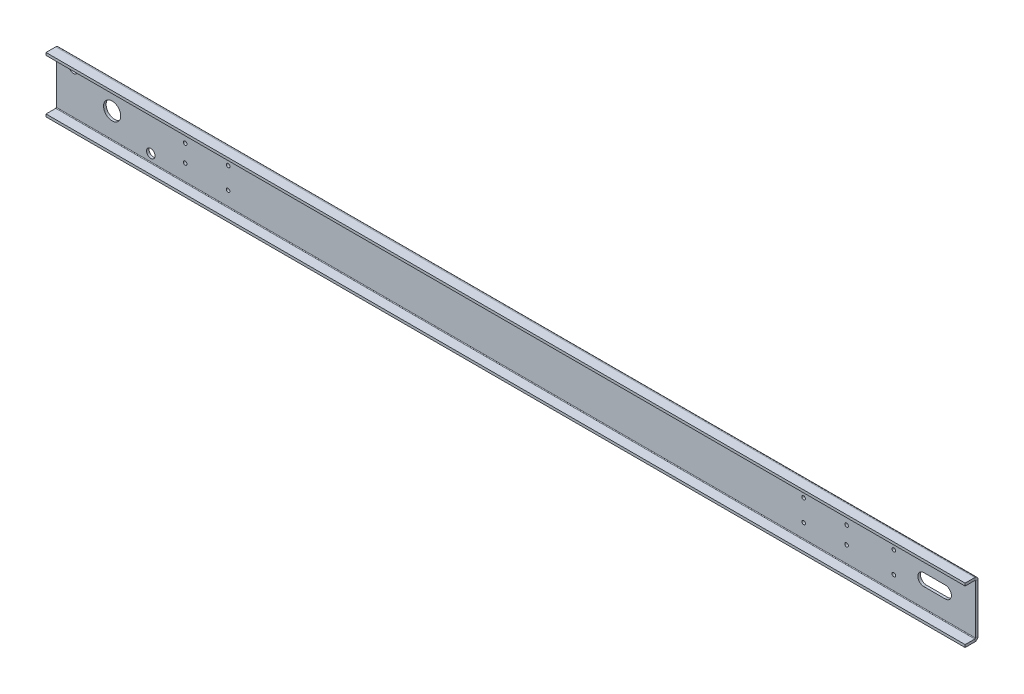
ISO-10303-21;
HEADER;
FILE_DESCRIPTION(('STEP AP214'),'2;1');
FILE_NAME('part.step','',(''),(''),'','','');
FILE_SCHEMA(('AUTOMOTIVE_DESIGN { 1 0 10303 214 1 1 1 1 }'));
ENDSEC;
DATA;
#1=APPLICATION_CONTEXT('core data for automotive mechanical design processes');
#2=APPLICATION_PROTOCOL_DEFINITION('international standard','automotive_design',2000,#1);
#3=PRODUCT_CONTEXT('',#1,'mechanical');
#4=PRODUCT('Part','Part','',(#3));
#5=PRODUCT_RELATED_PRODUCT_CATEGORY('part','',(#4));
#6=PRODUCT_DEFINITION_FORMATION('','',#4);
#7=PRODUCT_DEFINITION_CONTEXT('part definition',#1,'design');
#8=PRODUCT_DEFINITION('design','',#6,#7);
#9=PRODUCT_DEFINITION_SHAPE('','',#8);
#10=(LENGTH_UNIT() NAMED_UNIT(*) SI_UNIT(.MILLI.,.METRE.));
#11=(NAMED_UNIT(*) PLANE_ANGLE_UNIT() SI_UNIT($,.RADIAN.));
#12=(NAMED_UNIT(*) SI_UNIT($,.STERADIAN.) SOLID_ANGLE_UNIT());
#13=UNCERTAINTY_MEASURE_WITH_UNIT(LENGTH_MEASURE(1.E-05),#10,'distance_accuracy_value','');
#14=(GEOMETRIC_REPRESENTATION_CONTEXT(3) GLOBAL_UNCERTAINTY_ASSIGNED_CONTEXT((#13)) GLOBAL_UNIT_ASSIGNED_CONTEXT((#10,
#11,#12)) REPRESENTATION_CONTEXT('',''));
#15=CARTESIAN_POINT('',(0.,0.,0.));
#16=DIRECTION('',(0.,0.,1.));
#17=DIRECTION('',(1.,0.,0.));
#18=AXIS2_PLACEMENT_3D('',#15,#16,#17);
#19=CARTESIAN_POINT('',(535.,28.7634,0.));
#20=DIRECTION('',(1.,0.,0.));
#21=DIRECTION('',(0.,0.,-1.));
#22=AXIS2_PLACEMENT_3D('',#19,#20,#21);
#23=PLANE('',#22);
#24=DIRECTION('',(0.,0.,1.));
#25=VECTOR('',#24,1.);
#26=CARTESIAN_POINT('',(535.,28.7634,0.));
#27=LINE('',#26,#25);
#28=CARTESIAN_POINT('',(535.,28.7634,0.));
#29=VERTEX_POINT('',#28);
#30=CARTESIAN_POINT('',(535.,28.7634,3.));
#31=VERTEX_POINT('',#30);
#32=EDGE_CURVE('E300',#29,#31,#27,.T.);
#33=ORIENTED_EDGE('',*,*,#32,.F.);
#34=CARTESIAN_POINT('',(535.,28.7634,3.7366));
#35=DIRECTION('',(1.,0.,0.));
#36=DIRECTION('',(0.,0.,-1.));
#37=AXIS2_PLACEMENT_3D('',#34,#35,#36);
#38=CIRCLE('',#37,3.7366);
#39=CARTESIAN_POINT('',(535.,32.5,3.7366));
#40=VERTEX_POINT('',#39);
#41=EDGE_CURVE('E199',#40,#29,#38,.F.);
#42=ORIENTED_EDGE('',*,*,#41,.F.);
#43=DIRECTION('',(0.,1.,0.));
#44=VECTOR('',#43,1.);
#45=CARTESIAN_POINT('',(535.,29.5,3.7366));
#46=LINE('',#45,#44);
#47=CARTESIAN_POINT('',(535.,29.5,3.7366));
#48=VERTEX_POINT('',#47);
#49=EDGE_CURVE('E298',#48,#40,#46,.T.);
#50=ORIENTED_EDGE('',*,*,#49,.F.);
#51=CARTESIAN_POINT('',(535.,28.7634,3.7366));
#52=DIRECTION('',(1.,0.,0.));
#53=DIRECTION('',(0.,0.,-1.));
#54=AXIS2_PLACEMENT_3D('',#51,#52,#53);
#55=CIRCLE('',#54,0.7366);
#56=EDGE_CURVE('E211',#48,#31,#55,.F.);
#57=ORIENTED_EDGE('',*,*,#56,.T.);
#58=EDGE_LOOP('',(#33,#42,#50,#57));
#59=FACE_BOUND('',#58,.T.);
#60=ADVANCED_FACE('F41',(#59),#23,.T.);
#61=CARTESIAN_POINT('',(535.,29.5,3.7366));
#62=DIRECTION('',(1.,0.,0.));
#63=DIRECTION('',(0.,0.,-1.));
#64=AXIS2_PLACEMENT_3D('',#61,#62,#63);
#65=PLANE('',#64);
#66=DIRECTION('',(0.,-1.,0.));
#67=VECTOR('',#66,1.);
#68=CARTESIAN_POINT('',(535.,-32.5,0.));
#69=LINE('',#68,#67);
#70=CARTESIAN_POINT('',(535.,-28.7634,0.));
#71=VERTEX_POINT('',#70);
#72=EDGE_CURVE('E196',#29,#71,#69,.T.);
#73=ORIENTED_EDGE('',*,*,#72,.F.);
#74=ORIENTED_EDGE('',*,*,#32,.T.);
#75=DIRECTION('',(0.,1.,0.));
#76=VECTOR('',#75,1.);
#77=CARTESIAN_POINT('',(535.,-32.5,3.));
#78=LINE('',#77,#76);
#79=CARTESIAN_POINT('',(535.,-28.7634,3.));
#80=VERTEX_POINT('',#79);
#81=EDGE_CURVE('E214',#31,#80,#78,.F.);
#82=ORIENTED_EDGE('',*,*,#81,.T.);
#83=DIRECTION('',(0.,0.,-1.));
#84=VECTOR('',#83,1.);
#85=CARTESIAN_POINT('',(535.,-28.7634,3.));
#86=LINE('',#85,#84);
#87=EDGE_CURVE('E290',#80,#71,#86,.T.);
#88=ORIENTED_EDGE('',*,*,#87,.T.);
#89=EDGE_LOOP('',(#73,#74,#82,#88));
#90=FACE_BOUND('',#89,.T.);
#91=ADVANCED_FACE('F401',(#90),#65,.T.);
#92=CARTESIAN_POINT('',(-535.,32.5,3.7366));
#93=DIRECTION('',(-1.,0.,0.));
#94=DIRECTION('',(0.,0.,1.));
#95=AXIS2_PLACEMENT_3D('',#92,#93,#94);
#96=PLANE('',#95);
#97=DIRECTION('',(0.,-1.,0.));
#98=VECTOR('',#97,1.);
#99=CARTESIAN_POINT('',(-535.,32.5,3.7366));
#100=LINE('',#99,#98);
#101=CARTESIAN_POINT('',(-535.,32.5,3.7366));
#102=VERTEX_POINT('',#101);
#103=CARTESIAN_POINT('',(-535.,29.5,3.7366));
#104=VERTEX_POINT('',#103);
#105=EDGE_CURVE('E296',#102,#104,#100,.T.);
#106=ORIENTED_EDGE('',*,*,#105,.F.);
#107=CARTESIAN_POINT('',(-535.,28.7634,3.7366));
#108=DIRECTION('',(1.,0.,0.));
#109=DIRECTION('',(0.,0.,-1.));
#110=AXIS2_PLACEMENT_3D('',#107,#108,#109);
#111=CIRCLE('',#110,3.7366);
#112=CARTESIAN_POINT('',(-535.,28.7634,0.));
#113=VERTEX_POINT('',#112);
#114=EDGE_CURVE('E235',#102,#113,#111,.F.);
#115=ORIENTED_EDGE('',*,*,#114,.T.);
#116=DIRECTION('',(0.,0.,-1.));
#117=VECTOR('',#116,1.);
#118=CARTESIAN_POINT('',(-535.,28.7634,3.));
#119=LINE('',#118,#117);
#120=CARTESIAN_POINT('',(-535.,28.7634,3.));
#121=VERTEX_POINT('',#120);
#122=EDGE_CURVE('E294',#121,#113,#119,.T.);
#123=ORIENTED_EDGE('',*,*,#122,.F.);
#124=CARTESIAN_POINT('',(-535.,28.7634,3.7366));
#125=DIRECTION('',(1.,0.,0.));
#126=DIRECTION('',(0.,0.,-1.));
#127=AXIS2_PLACEMENT_3D('',#124,#125,#126);
#128=CIRCLE('',#127,0.7366);
#129=EDGE_CURVE('E247',#104,#121,#128,.F.);
#130=ORIENTED_EDGE('',*,*,#129,.F.);
#131=EDGE_LOOP('',(#106,#115,#123,#130));
#132=FACE_BOUND('',#131,.T.);
#133=ADVANCED_FACE('F406',(#132),#96,.T.);
#134=CARTESIAN_POINT('',(-535.,28.7634,3.));
#135=DIRECTION('',(-1.,0.,0.));
#136=DIRECTION('',(0.,0.,1.));
#137=AXIS2_PLACEMENT_3D('',#134,#135,#136);
#138=PLANE('',#137);
#139=DIRECTION('',(0.,0.,-1.));
#140=VECTOR('',#139,1.);
#141=CARTESIAN_POINT('',(-535.,32.5,0.));
#142=LINE('',#141,#140);
#143=CARTESIAN_POINT('',(-535.,32.5,15.));
#144=VERTEX_POINT('',#143);
#145=EDGE_CURVE('E238',#144,#102,#142,.T.);
#146=ORIENTED_EDGE('',*,*,#145,.T.);
#147=ORIENTED_EDGE('',*,*,#105,.T.);
#148=DIRECTION('',(0.,0.,-1.));
#149=VECTOR('',#148,1.);
#150=CARTESIAN_POINT('',(-535.,29.5,0.));
#151=LINE('',#150,#149);
#152=CARTESIAN_POINT('',(-535.,29.5,15.));
#153=VERTEX_POINT('',#152);
#154=EDGE_CURVE('E244',#153,#104,#151,.T.);
#155=ORIENTED_EDGE('',*,*,#154,.F.);
#156=DIRECTION('',(0.,1.,0.));
#157=VECTOR('',#156,1.);
#158=CARTESIAN_POINT('',(-535.,29.5,15.));
#159=LINE('',#158,#157);
#160=EDGE_CURVE('E241',#153,#144,#159,.T.);
#161=ORIENTED_EDGE('',*,*,#160,.T.);
#162=EDGE_LOOP('',(#146,#147,#155,#161));
#163=FACE_BOUND('',#162,.T.);
#164=ADVANCED_FACE('F460',(#163),#138,.T.);
#165=CARTESIAN_POINT('',(535.,-32.5,3.7366));
#166=DIRECTION('',(1.,0.,0.));
#167=DIRECTION('',(0.,0.,-1.));
#168=AXIS2_PLACEMENT_3D('',#165,#166,#167);
#169=PLANE('',#168);
#170=DIRECTION('',(0.,1.,0.));
#171=VECTOR('',#170,1.);
#172=CARTESIAN_POINT('',(535.,-32.5,3.7366));
#173=LINE('',#172,#171);
#174=CARTESIAN_POINT('',(535.,-32.5,3.7366));
#175=VERTEX_POINT('',#174);
#176=CARTESIAN_POINT('',(535.,-29.5,3.7366));
#177=VERTEX_POINT('',#176);
#178=EDGE_CURVE('E292',#175,#177,#173,.T.);
#179=ORIENTED_EDGE('',*,*,#178,.F.);
#180=CARTESIAN_POINT('',(535.,-28.7634,3.7366));
#181=DIRECTION('',(1.,0.,0.));
#182=DIRECTION('',(0.,0.,-1.));
#183=AXIS2_PLACEMENT_3D('',#180,#181,#182);
#184=CIRCLE('',#183,3.7366);
#185=EDGE_CURVE('E193',#71,#175,#184,.F.);
#186=ORIENTED_EDGE('',*,*,#185,.F.);
#187=ORIENTED_EDGE('',*,*,#87,.F.);
#188=CARTESIAN_POINT('',(535.,-28.7634,3.7366));
#189=DIRECTION('',(1.,0.,0.));
#190=DIRECTION('',(0.,0.,-1.));
#191=AXIS2_PLACEMENT_3D('',#188,#189,#190);
#192=CIRCLE('',#191,0.7366);
#193=EDGE_CURVE('E217',#80,#177,#192,.F.);
#194=ORIENTED_EDGE('',*,*,#193,.T.);
#195=EDGE_LOOP('',(#179,#186,#187,#194));
#196=FACE_BOUND('',#195,.T.);
#197=ADVANCED_FACE('F448',(#196),#169,.T.);
#198=CARTESIAN_POINT('',(535.,-28.7634,3.));
#199=DIRECTION('',(1.,0.,0.));
#200=DIRECTION('',(0.,0.,-1.));
#201=AXIS2_PLACEMENT_3D('',#198,#199,#200);
#202=PLANE('',#201);
#203=DIRECTION('',(0.,0.,1.));
#204=VECTOR('',#203,1.);
#205=CARTESIAN_POINT('',(535.,-32.5,0.));
#206=LINE('',#205,#204);
#207=CARTESIAN_POINT('',(535.,-32.5,15.));
#208=VERTEX_POINT('',#207);
#209=EDGE_CURVE('E190',#175,#208,#206,.T.);
#210=ORIENTED_EDGE('',*,*,#209,.F.);
#211=ORIENTED_EDGE('',*,*,#178,.T.);
#212=DIRECTION('',(0.,0.,-1.));
#213=VECTOR('',#212,1.);
#214=CARTESIAN_POINT('',(535.,-29.5,0.));
#215=LINE('',#214,#213);
#216=CARTESIAN_POINT('',(535.,-29.5,15.));
#217=VERTEX_POINT('',#216);
#218=EDGE_CURVE('E184',#177,#217,#215,.F.);
#219=ORIENTED_EDGE('',*,*,#218,.T.);
#220=DIRECTION('',(0.,1.,0.));
#221=VECTOR('',#220,1.);
#222=CARTESIAN_POINT('',(535.,-32.5,15.));
#223=LINE('',#222,#221);
#224=EDGE_CURVE('E186',#208,#217,#223,.T.);
#225=ORIENTED_EDGE('',*,*,#224,.F.);
#226=EDGE_LOOP('',(#210,#211,#219,#225));
#227=FACE_BOUND('',#226,.T.);
#228=ADVANCED_FACE('F467',(#227),#202,.T.);
#229=CARTESIAN_POINT('',(-535.,-28.7634,0.));
#230=DIRECTION('',(-1.,0.,0.));
#231=DIRECTION('',(0.,0.,1.));
#232=AXIS2_PLACEMENT_3D('',#229,#230,#231);
#233=PLANE('',#232);
#234=DIRECTION('',(0.,0.,1.));
#235=VECTOR('',#234,1.);
#236=CARTESIAN_POINT('',(-535.,-28.7634,0.));
#237=LINE('',#236,#235);
#238=CARTESIAN_POINT('',(-535.,-28.7634,0.));
#239=VERTEX_POINT('',#238);
#240=CARTESIAN_POINT('',(-535.,-28.7634,3.));
#241=VERTEX_POINT('',#240);
#242=EDGE_CURVE('E288',#239,#241,#237,.T.);
#243=ORIENTED_EDGE('',*,*,#242,.F.);
#244=CARTESIAN_POINT('',(-535.,-28.7634,3.7366));
#245=DIRECTION('',(1.,0.,0.));
#246=DIRECTION('',(0.,0.,-1.));
#247=AXIS2_PLACEMENT_3D('',#244,#245,#246);
#248=CIRCLE('',#247,3.7366);
#249=CARTESIAN_POINT('',(-535.,-32.5,3.7366));
#250=VERTEX_POINT('',#249);
#251=EDGE_CURVE('E229',#239,#250,#248,.F.);
#252=ORIENTED_EDGE('',*,*,#251,.T.);
#253=DIRECTION('',(0.,-1.,0.));
#254=VECTOR('',#253,1.);
#255=CARTESIAN_POINT('',(-535.,-29.5,3.7366));
#256=LINE('',#255,#254);
#257=CARTESIAN_POINT('',(-535.,-29.5,3.7366));
#258=VERTEX_POINT('',#257);
#259=EDGE_CURVE('E286',#258,#250,#256,.T.);
#260=ORIENTED_EDGE('',*,*,#259,.F.);
#261=CARTESIAN_POINT('',(-535.,-28.7634,3.7366));
#262=DIRECTION('',(1.,0.,0.));
#263=DIRECTION('',(0.,0.,-1.));
#264=AXIS2_PLACEMENT_3D('',#261,#262,#263);
#265=CIRCLE('',#264,0.7366);
#266=EDGE_CURVE('E187',#241,#258,#265,.F.);
#267=ORIENTED_EDGE('',*,*,#266,.F.);
#268=EDGE_LOOP('',(#243,#252,#260,#267));
#269=FACE_BOUND('',#268,.T.);
#270=ADVANCED_FACE('F473',(#269),#233,.T.);
#271=CARTESIAN_POINT('',(-535.,-29.5,3.7366));
#272=DIRECTION('',(-1.,0.,0.));
#273=DIRECTION('',(0.,0.,1.));
#274=AXIS2_PLACEMENT_3D('',#271,#272,#273);
#275=PLANE('',#274);
#276=DIRECTION('',(0.,-1.,0.));
#277=VECTOR('',#276,1.);
#278=CARTESIAN_POINT('',(-535.,-32.5,0.));
#279=LINE('',#278,#277);
#280=EDGE_CURVE('E232',#113,#239,#279,.T.);
#281=ORIENTED_EDGE('',*,*,#280,.T.);
#282=ORIENTED_EDGE('',*,*,#242,.T.);
#283=DIRECTION('',(0.,1.,0.));
#284=VECTOR('',#283,1.);
#285=CARTESIAN_POINT('',(-535.,-32.5,3.));
#286=LINE('',#285,#284);
#287=EDGE_CURVE('E250',#121,#241,#286,.F.);
#288=ORIENTED_EDGE('',*,*,#287,.F.);
#289=ORIENTED_EDGE('',*,*,#122,.T.);
#290=EDGE_LOOP('',(#281,#282,#288,#289));
#291=FACE_BOUND('',#290,.T.);
#292=ADVANCED_FACE('F457',(#291),#275,.T.);
#293=CARTESIAN_POINT('',(535.,-29.5,0.));
#294=DIRECTION('',(0.,-1.,0.));
#295=DIRECTION('',(0.,0.,-1.));
#296=AXIS2_PLACEMENT_3D('',#293,#294,#295);
#297=PLANE('',#296);
#298=DIRECTION('',(0.,0.,-1.));
#299=VECTOR('',#298,1.);
#300=CARTESIAN_POINT('',(-535.,-29.5,0.));
#301=LINE('',#300,#299);
#302=CARTESIAN_POINT('',(-535.,-29.5,15.));
#303=VERTEX_POINT('',#302);
#304=EDGE_CURVE('E181',#258,#303,#301,.F.);
#305=ORIENTED_EDGE('',*,*,#304,.T.);
#306=DIRECTION('',(-1.,0.,0.));
#307=VECTOR('',#306,1.);
#308=CARTESIAN_POINT('',(535.,-29.5,15.));
#309=LINE('',#308,#307);
#310=EDGE_CURVE('E284',#217,#303,#309,.T.);
#311=ORIENTED_EDGE('',*,*,#310,.F.);
#312=ORIENTED_EDGE('',*,*,#218,.F.);
#313=DIRECTION('',(-1.,0.,0.));
#314=VECTOR('',#313,1.);
#315=CARTESIAN_POINT('',(535.,-29.5,3.7366));
#316=LINE('',#315,#314);
#317=EDGE_CURVE('E220',#177,#258,#316,.T.);
#318=ORIENTED_EDGE('',*,*,#317,.T.);
#319=EDGE_LOOP('',(#305,#311,#312,#318));
#320=FACE_BOUND('',#319,.T.);
#321=ADVANCED_FACE('F479',(#320),#297,.F.);
#322=CARTESIAN_POINT('',(535.,-32.5,15.));
#323=DIRECTION('',(0.,0.,1.));
#324=DIRECTION('',(1.,0.,0.));
#325=AXIS2_PLACEMENT_3D('',#322,#323,#324);
#326=PLANE('',#325);
#327=DIRECTION('',(0.,1.,0.));
#328=VECTOR('',#327,1.);
#329=CARTESIAN_POINT('',(-535.,-32.5,15.));
#330=LINE('',#329,#328);
#331=CARTESIAN_POINT('',(-535.,-32.5,15.));
#332=VERTEX_POINT('',#331);
#333=EDGE_CURVE('E223',#332,#303,#330,.T.);
#334=ORIENTED_EDGE('',*,*,#333,.F.);
#335=DIRECTION('',(-1.,0.,0.));
#336=VECTOR('',#335,1.);
#337=CARTESIAN_POINT('',(535.,-32.5,15.));
#338=LINE('',#337,#336);
#339=EDGE_CURVE('E282',#208,#332,#338,.T.);
#340=ORIENTED_EDGE('',*,*,#339,.F.);
#341=ORIENTED_EDGE('',*,*,#224,.T.);
#342=ORIENTED_EDGE('',*,*,#310,.T.);
#343=EDGE_LOOP('',(#334,#340,#341,#342));
#344=FACE_BOUND('',#343,.T.);
#345=ADVANCED_FACE('F482',(#344),#326,.T.);
#346=CARTESIAN_POINT('',(535.,-32.5,0.));
#347=DIRECTION('',(0.,-1.,0.));
#348=DIRECTION('',(0.,0.,-1.));
#349=AXIS2_PLACEMENT_3D('',#346,#347,#348);
#350=PLANE('',#349);
#351=DIRECTION('',(0.,0.,1.));
#352=VECTOR('',#351,1.);
#353=CARTESIAN_POINT('',(-535.,-32.5,0.));
#354=LINE('',#353,#352);
#355=EDGE_CURVE('E226',#250,#332,#354,.T.);
#356=ORIENTED_EDGE('',*,*,#355,.F.);
#357=DIRECTION('',(-1.,0.,0.));
#358=VECTOR('',#357,1.);
#359=CARTESIAN_POINT('',(535.,-32.5,3.7366));
#360=LINE('',#359,#358);
#361=EDGE_CURVE('E279',#175,#250,#360,.T.);
#362=ORIENTED_EDGE('',*,*,#361,.F.);
#363=ORIENTED_EDGE('',*,*,#209,.T.);
#364=ORIENTED_EDGE('',*,*,#339,.T.);
#365=EDGE_LOOP('',(#356,#362,#363,#364));
#366=FACE_BOUND('',#365,.T.);
#367=ADVANCED_FACE('F486',(#366),#350,.T.);
#368=CARTESIAN_POINT('',(535.,-28.7634,3.7366));
#369=DIRECTION('',(-1.,0.,0.));
#370=DIRECTION('',(0.,0.,1.));
#371=AXIS2_PLACEMENT_3D('',#368,#369,#370);
#372=CYLINDRICAL_SURFACE('',#371,3.7366);
#373=ORIENTED_EDGE('',*,*,#251,.F.);
#374=DIRECTION('',(-1.,0.,0.));
#375=VECTOR('',#374,1.);
#376=CARTESIAN_POINT('',(535.,-28.7634,0.));
#377=LINE('',#376,#375);
#378=EDGE_CURVE('E276',#71,#239,#377,.T.);
#379=ORIENTED_EDGE('',*,*,#378,.F.);
#380=ORIENTED_EDGE('',*,*,#185,.T.);
#381=ORIENTED_EDGE('',*,*,#361,.T.);
#382=EDGE_LOOP('',(#373,#379,#380,#381));
#383=FACE_BOUND('',#382,.T.);
#384=ADVANCED_FACE('F453',(#383),#372,.T.);
#385=CARTESIAN_POINT('',(535.,-32.5,0.));
#386=DIRECTION('',(0.,0.,-1.));
#387=DIRECTION('',(-1.,0.,0.));
#388=AXIS2_PLACEMENT_3D('',#385,#386,#387);
#389=PLANE('',#388);
#390=CARTESIAN_POINT('',(-425.,-20.2899203219766,0.));
#391=DIRECTION('',(0.,0.,-1.));
#392=DIRECTION('',(1.,0.,0.));
#393=AXIS2_PLACEMENT_3D('',#390,#391,#392);
#394=CIRCLE('',#393,5.00000000000001);
#395=CARTESIAN_POINT('',(-420.,-20.2899203219766,0.));
#396=VERTEX_POINT('',#395);
#397=EDGE_CURVE('E707',#396,#396,#394,.T.);
#398=ORIENTED_EDGE('',*,*,#397,.F.);
#399=EDGE_LOOP('',(#398));
#400=FACE_BOUND('',#399,.T.);
#401=CARTESIAN_POINT('',(-515.,20.289920321977,0.));
#402=DIRECTION('',(0.,0.,-1.));
#403=DIRECTION('',(-1.,0.,0.));
#404=AXIS2_PLACEMENT_3D('',#401,#402,#403);
#405=CIRCLE('',#404,5.00000000000004);
#406=CARTESIAN_POINT('',(-520.,20.289920321977,0.));
#407=VERTEX_POINT('',#406);
#408=EDGE_CURVE('E708',#407,#407,#405,.T.);
#409=ORIENTED_EDGE('',*,*,#408,.F.);
#410=EDGE_LOOP('',(#409));
#411=FACE_BOUND('',#410,.T.);
#412=CARTESIAN_POINT('',(-470.,0.,0.));
#413=DIRECTION('',(0.,0.,-1.));
#414=DIRECTION('',(-1.,0.,0.));
#415=AXIS2_PLACEMENT_3D('',#412,#413,#414);
#416=CIRCLE('',#415,10.);
#417=CARTESIAN_POINT('',(-480.,0.,0.));
#418=VERTEX_POINT('',#417);
#419=EDGE_CURVE('E324',#418,#418,#416,.T.);
#420=ORIENTED_EDGE('',*,*,#419,.F.);
#421=EDGE_LOOP('',(#420));
#422=FACE_BOUND('',#421,.T.);
#423=CARTESIAN_POINT('',(-335.,12.5,0.));
#424=DIRECTION('',(0.,0.,-1.));
#425=DIRECTION('',(-1.,0.,0.));
#426=AXIS2_PLACEMENT_3D('',#423,#424,#425);
#427=CIRCLE('',#426,2.09999999999999);
#428=CARTESIAN_POINT('',(-337.1,12.5,0.));
#429=VERTEX_POINT('',#428);
#430=EDGE_CURVE('E320',#429,#429,#427,.T.);
#431=ORIENTED_EDGE('',*,*,#430,.F.);
#432=EDGE_LOOP('',(#431));
#433=FACE_BOUND('',#432,.T.);
#434=CARTESIAN_POINT('',(-335.,-12.5,0.));
#435=DIRECTION('',(0.,0.,-1.));
#436=DIRECTION('',(-1.,0.,0.));
#437=AXIS2_PLACEMENT_3D('',#434,#435,#436);
#438=CIRCLE('',#437,2.09999999999999);
#439=CARTESIAN_POINT('',(-337.1,-12.5,0.));
#440=VERTEX_POINT('',#439);
#441=EDGE_CURVE('E316',#440,#440,#438,.T.);
#442=ORIENTED_EDGE('',*,*,#441,.F.);
#443=EDGE_LOOP('',(#442));
#444=FACE_BOUND('',#443,.T.);
#445=CARTESIAN_POINT('',(-385.,10.,0.));
#446=DIRECTION('',(0.,0.,-1.));
#447=DIRECTION('',(-1.,0.,0.));
#448=AXIS2_PLACEMENT_3D('',#445,#446,#447);
#449=CIRCLE('',#448,2.09999999999999);
#450=CARTESIAN_POINT('',(-387.1,10.,0.));
#451=VERTEX_POINT('',#450);
#452=EDGE_CURVE('E315',#451,#451,#449,.T.);
#453=ORIENTED_EDGE('',*,*,#452,.F.);
#454=EDGE_LOOP('',(#453));
#455=FACE_BOUND('',#454,.T.);
#456=CARTESIAN_POINT('',(-385.,-10.,0.));
#457=DIRECTION('',(0.,0.,-1.));
#458=DIRECTION('',(-1.,0.,0.));
#459=AXIS2_PLACEMENT_3D('',#456,#457,#458);
#460=CIRCLE('',#459,2.09999999999999);
#461=CARTESIAN_POINT('',(-387.1,-10.,0.));
#462=VERTEX_POINT('',#461);
#463=EDGE_CURVE('E345',#462,#462,#460,.T.);
#464=ORIENTED_EDGE('',*,*,#463,.F.);
#465=EDGE_LOOP('',(#464));
#466=FACE_BOUND('',#465,.T.);
#467=CARTESIAN_POINT('',(335.,12.5,0.));
#468=DIRECTION('',(0.,0.,-1.));
#469=DIRECTION('',(-1.,0.,0.));
#470=AXIS2_PLACEMENT_3D('',#467,#468,#469);
#471=CIRCLE('',#470,2.09999999999999);
#472=CARTESIAN_POINT('',(332.9,12.5,0.));
#473=VERTEX_POINT('',#472);
#474=EDGE_CURVE('E351',#473,#473,#471,.T.);
#475=ORIENTED_EDGE('',*,*,#474,.F.);
#476=EDGE_LOOP('',(#475));
#477=FACE_BOUND('',#476,.T.);
#478=CARTESIAN_POINT('',(335.,-12.5,0.));
#479=DIRECTION('',(0.,0.,-1.));
#480=DIRECTION('',(-1.,0.,0.));
#481=AXIS2_PLACEMENT_3D('',#478,#479,#480);
#482=CIRCLE('',#481,2.09999999999999);
#483=CARTESIAN_POINT('',(332.9,-12.5,0.));
#484=VERTEX_POINT('',#483);
#485=EDGE_CURVE('E357',#484,#484,#482,.T.);
#486=ORIENTED_EDGE('',*,*,#485,.F.);
#487=EDGE_LOOP('',(#486));
#488=FACE_BOUND('',#487,.T.);
#489=CARTESIAN_POINT('',(385.,10.,0.));
#490=DIRECTION('',(0.,0.,-1.));
#491=DIRECTION('',(-1.,0.,0.));
#492=AXIS2_PLACEMENT_3D('',#489,#490,#491);
#493=CIRCLE('',#492,2.09999999999999);
#494=CARTESIAN_POINT('',(382.9,10.,0.));
#495=VERTEX_POINT('',#494);
#496=EDGE_CURVE('E363',#495,#495,#493,.T.);
#497=ORIENTED_EDGE('',*,*,#496,.F.);
#498=EDGE_LOOP('',(#497));
#499=FACE_BOUND('',#498,.T.);
#500=CARTESIAN_POINT('',(385.,-10.,0.));
#501=DIRECTION('',(0.,0.,-1.));
#502=DIRECTION('',(-1.,0.,0.));
#503=AXIS2_PLACEMENT_3D('',#500,#501,#502);
#504=CIRCLE('',#503,2.09999999999999);
#505=CARTESIAN_POINT('',(382.9,-10.,0.));
#506=VERTEX_POINT('',#505);
#507=EDGE_CURVE('E369',#506,#506,#504,.T.);
#508=ORIENTED_EDGE('',*,*,#507,.F.);
#509=EDGE_LOOP('',(#508));
#510=FACE_BOUND('',#509,.T.);
#511=CARTESIAN_POINT('',(440.,12.5,0.));
#512=DIRECTION('',(0.,0.,-1.));
#513=DIRECTION('',(-1.,0.,0.));
#514=AXIS2_PLACEMENT_3D('',#511,#512,#513);
#515=CIRCLE('',#514,2.09999999999999);
#516=CARTESIAN_POINT('',(437.9,12.5,0.));
#517=VERTEX_POINT('',#516);
#518=EDGE_CURVE('E311',#517,#517,#515,.T.);
#519=ORIENTED_EDGE('',*,*,#518,.F.);
#520=EDGE_LOOP('',(#519));
#521=FACE_BOUND('',#520,.T.);
#522=CARTESIAN_POINT('',(440.,-12.5,0.));
#523=DIRECTION('',(0.,0.,-1.));
#524=DIRECTION('',(-1.,0.,0.));
#525=AXIS2_PLACEMENT_3D('',#522,#523,#524);
#526=CIRCLE('',#525,2.09999999999999);
#527=CARTESIAN_POINT('',(437.9,-12.5,0.));
#528=VERTEX_POINT('',#527);
#529=EDGE_CURVE('E310',#528,#528,#526,.T.);
#530=ORIENTED_EDGE('',*,*,#529,.F.);
#531=EDGE_LOOP('',(#530));
#532=FACE_BOUND('',#531,.T.);
#533=CARTESIAN_POINT('',(500.,0.,0.));
#534=DIRECTION('',(0.,0.,-1.));
#535=DIRECTION('',(-1.,0.,0.));
#536=AXIS2_PLACEMENT_3D('',#533,#534,#535);
#537=CIRCLE('',#536,7.);
#538=CARTESIAN_POINT('',(500.,7.,0.));
#539=VERTEX_POINT('',#538);
#540=CARTESIAN_POINT('',(500.,-7.,0.));
#541=VERTEX_POINT('',#540);
#542=EDGE_CURVE('E57',#539,#541,#537,.T.);
#543=ORIENTED_EDGE('',*,*,#542,.F.);
#544=DIRECTION('',(1.,0.,0.));
#545=VECTOR('',#544,1.);
#546=CARTESIAN_POINT('',(500.,7.,0.));
#547=LINE('',#546,#545);
#548=CARTESIAN_POINT('',(475.,7.,0.));
#549=VERTEX_POINT('',#548);
#550=EDGE_CURVE('E174',#549,#539,#547,.T.);
#551=ORIENTED_EDGE('',*,*,#550,.F.);
#552=CARTESIAN_POINT('',(475.,0.,0.));
#553=DIRECTION('',(0.,0.,-1.));
#554=DIRECTION('',(-1.,0.,0.));
#555=AXIS2_PLACEMENT_3D('',#552,#553,#554);
#556=CIRCLE('',#555,7.);
#557=CARTESIAN_POINT('',(475.,-7.,0.));
#558=VERTEX_POINT('',#557);
#559=EDGE_CURVE('E158',#558,#549,#556,.T.);
#560=ORIENTED_EDGE('',*,*,#559,.F.);
#561=DIRECTION('',(-1.,0.,0.));
#562=VECTOR('',#561,1.);
#563=CARTESIAN_POINT('',(500.,-7.,0.));
#564=LINE('',#563,#562);
#565=EDGE_CURVE('E167',#541,#558,#564,.T.);
#566=ORIENTED_EDGE('',*,*,#565,.F.);
#567=EDGE_LOOP('',(#543,#551,#560,#566));
#568=FACE_BOUND('',#567,.T.);
#569=ORIENTED_EDGE('',*,*,#280,.F.);
#570=DIRECTION('',(-1.,0.,0.));
#571=VECTOR('',#570,1.);
#572=CARTESIAN_POINT('',(535.,28.7634,0.));
#573=LINE('',#572,#571);
#574=EDGE_CURVE('E273',#29,#113,#573,.T.);
#575=ORIENTED_EDGE('',*,*,#574,.F.);
#576=ORIENTED_EDGE('',*,*,#72,.T.);
#577=ORIENTED_EDGE('',*,*,#378,.T.);
#578=EDGE_LOOP('',(#569,#575,#576,#577));
#579=FACE_BOUND('',#578,.T.);
#580=ADVANCED_FACE('F171',(#400,#411,#422,#433,#444,#455,#466,#477,#488,#499,#510,#521,#532,
#568,#579),#389,.T.);
#581=CARTESIAN_POINT('',(535.,28.7634,3.7366));
#582=DIRECTION('',(-1.,0.,0.));
#583=DIRECTION('',(0.,0.,1.));
#584=AXIS2_PLACEMENT_3D('',#581,#582,#583);
#585=CYLINDRICAL_SURFACE('',#584,3.7366);
#586=ORIENTED_EDGE('',*,*,#114,.F.);
#587=DIRECTION('',(-1.,0.,0.));
#588=VECTOR('',#587,1.);
#589=CARTESIAN_POINT('',(535.,32.5,3.7366));
#590=LINE('',#589,#588);
#591=EDGE_CURVE('E270',#40,#102,#590,.T.);
#592=ORIENTED_EDGE('',*,*,#591,.F.);
#593=ORIENTED_EDGE('',*,*,#41,.T.);
#594=ORIENTED_EDGE('',*,*,#574,.T.);
#595=EDGE_LOOP('',(#586,#592,#593,#594));
#596=FACE_BOUND('',#595,.T.);
#597=ADVANCED_FACE('F418',(#596),#585,.T.);
#598=CARTESIAN_POINT('',(535.,32.5,0.));
#599=DIRECTION('',(0.,1.,0.));
#600=DIRECTION('',(0.,0.,1.));
#601=AXIS2_PLACEMENT_3D('',#598,#599,#600);
#602=PLANE('',#601);
#603=ORIENTED_EDGE('',*,*,#145,.F.);
#604=DIRECTION('',(-1.,0.,0.));
#605=VECTOR('',#604,1.);
#606=CARTESIAN_POINT('',(535.,32.5,15.));
#607=LINE('',#606,#605);
#608=CARTESIAN_POINT('',(535.,32.5,15.));
#609=VERTEX_POINT('',#608);
#610=EDGE_CURVE('E268',#609,#144,#607,.T.);
#611=ORIENTED_EDGE('',*,*,#610,.F.);
#612=DIRECTION('',(0.,0.,-1.));
#613=VECTOR('',#612,1.);
#614=CARTESIAN_POINT('',(535.,32.5,0.));
#615=LINE('',#614,#613);
#616=EDGE_CURVE('E202',#609,#40,#615,.T.);
#617=ORIENTED_EDGE('',*,*,#616,.T.);
#618=ORIENTED_EDGE('',*,*,#591,.T.);
#619=EDGE_LOOP('',(#603,#611,#617,#618));
#620=FACE_BOUND('',#619,.T.);
#621=ADVANCED_FACE('F421',(#620),#602,.T.);
#622=CARTESIAN_POINT('',(535.,29.5,15.));
#623=DIRECTION('',(0.,0.,1.));
#624=DIRECTION('',(1.,0.,0.));
#625=AXIS2_PLACEMENT_3D('',#622,#623,#624);
#626=PLANE('',#625);
#627=ORIENTED_EDGE('',*,*,#160,.F.);
#628=DIRECTION('',(-1.,0.,0.));
#629=VECTOR('',#628,1.);
#630=CARTESIAN_POINT('',(535.,29.5,15.));
#631=LINE('',#630,#629);
#632=CARTESIAN_POINT('',(535.,29.5,15.));
#633=VERTEX_POINT('',#632);
#634=EDGE_CURVE('E266',#633,#153,#631,.T.);
#635=ORIENTED_EDGE('',*,*,#634,.F.);
#636=DIRECTION('',(0.,1.,0.));
#637=VECTOR('',#636,1.);
#638=CARTESIAN_POINT('',(535.,29.5,15.));
#639=LINE('',#638,#637);
#640=EDGE_CURVE('E205',#633,#609,#639,.T.);
#641=ORIENTED_EDGE('',*,*,#640,.T.);
#642=ORIENTED_EDGE('',*,*,#610,.T.);
#643=EDGE_LOOP('',(#627,#635,#641,#642));
#644=FACE_BOUND('',#643,.T.);
#645=ADVANCED_FACE('F428',(#644),#626,.T.);
#646=CARTESIAN_POINT('',(535.,29.5,0.));
#647=DIRECTION('',(0.,1.,0.));
#648=DIRECTION('',(0.,0.,1.));
#649=AXIS2_PLACEMENT_3D('',#646,#647,#648);
#650=PLANE('',#649);
#651=ORIENTED_EDGE('',*,*,#154,.T.);
#652=DIRECTION('',(-1.,0.,0.));
#653=VECTOR('',#652,1.);
#654=CARTESIAN_POINT('',(535.,29.5,3.7366));
#655=LINE('',#654,#653);
#656=EDGE_CURVE('E263',#48,#104,#655,.T.);
#657=ORIENTED_EDGE('',*,*,#656,.F.);
#658=DIRECTION('',(0.,0.,-1.));
#659=VECTOR('',#658,1.);
#660=CARTESIAN_POINT('',(535.,29.5,0.));
#661=LINE('',#660,#659);
#662=EDGE_CURVE('E208',#633,#48,#661,.T.);
#663=ORIENTED_EDGE('',*,*,#662,.F.);
#664=ORIENTED_EDGE('',*,*,#634,.T.);
#665=EDGE_LOOP('',(#651,#657,#663,#664));
#666=FACE_BOUND('',#665,.T.);
#667=ADVANCED_FACE('F433',(#666),#650,.F.);
#668=CARTESIAN_POINT('',(535.,28.7634,3.7366));
#669=DIRECTION('',(-1.,0.,0.));
#670=DIRECTION('',(0.,0.,1.));
#671=AXIS2_PLACEMENT_3D('',#668,#669,#670);
#672=CYLINDRICAL_SURFACE('',#671,0.7366);
#673=ORIENTED_EDGE('',*,*,#129,.T.);
#674=DIRECTION('',(-1.,0.,0.));
#675=VECTOR('',#674,1.);
#676=CARTESIAN_POINT('',(535.,28.7634,3.));
#677=LINE('',#676,#675);
#678=EDGE_CURVE('E260',#31,#121,#677,.T.);
#679=ORIENTED_EDGE('',*,*,#678,.F.);
#680=ORIENTED_EDGE('',*,*,#56,.F.);
#681=ORIENTED_EDGE('',*,*,#656,.T.);
#682=EDGE_LOOP('',(#673,#679,#680,#681));
#683=FACE_BOUND('',#682,.T.);
#684=ADVANCED_FACE('F436',(#683),#672,.F.);
#685=CARTESIAN_POINT('',(535.,-32.5,3.));
#686=DIRECTION('',(0.,0.,-1.));
#687=DIRECTION('',(-1.,0.,0.));
#688=AXIS2_PLACEMENT_3D('',#685,#686,#687);
#689=PLANE('',#688);
#690=CARTESIAN_POINT('',(-425.,-20.2899203219766,3.));
#691=DIRECTION('',(0.,0.,-1.));
#692=DIRECTION('',(-1.,0.,0.));
#693=AXIS2_PLACEMENT_3D('',#690,#691,#692);
#694=CIRCLE('',#693,5.00000000000001);
#695=CARTESIAN_POINT('',(-430.,-20.2899203219766,3.));
#696=VERTEX_POINT('',#695);
#697=EDGE_CURVE('E44',#696,#696,#694,.T.);
#698=ORIENTED_EDGE('',*,*,#697,.T.);
#699=EDGE_LOOP('',(#698));
#700=FACE_BOUND('',#699,.T.);
#701=CARTESIAN_POINT('',(-515.,20.289920321977,3.));
#702=DIRECTION('',(0.,0.,-1.));
#703=DIRECTION('',(-1.,0.,0.));
#704=AXIS2_PLACEMENT_3D('',#701,#702,#703);
#705=CIRCLE('',#704,5.00000000000004);
#706=CARTESIAN_POINT('',(-520.,20.289920321977,3.));
#707=VERTEX_POINT('',#706);
#708=EDGE_CURVE('E323',#707,#707,#705,.T.);
#709=ORIENTED_EDGE('',*,*,#708,.T.);
#710=EDGE_LOOP('',(#709));
#711=FACE_BOUND('',#710,.T.);
#712=CARTESIAN_POINT('',(-470.,0.,3.));
#713=DIRECTION('',(0.,0.,-1.));
#714=DIRECTION('',(-1.,0.,0.));
#715=AXIS2_PLACEMENT_3D('',#712,#713,#714);
#716=CIRCLE('',#715,10.);
#717=CARTESIAN_POINT('',(-480.,0.,3.));
#718=VERTEX_POINT('',#717);
#719=EDGE_CURVE('E321',#718,#718,#716,.T.);
#720=ORIENTED_EDGE('',*,*,#719,.T.);
#721=EDGE_LOOP('',(#720));
#722=FACE_BOUND('',#721,.T.);
#723=CARTESIAN_POINT('',(-335.,12.5,3.));
#724=DIRECTION('',(0.,0.,-1.));
#725=DIRECTION('',(-1.,0.,0.));
#726=AXIS2_PLACEMENT_3D('',#723,#724,#725);
#727=CIRCLE('',#726,2.09999999999999);
#728=CARTESIAN_POINT('',(-337.1,12.5,3.));
#729=VERTEX_POINT('',#728);
#730=EDGE_CURVE('E317',#729,#729,#727,.T.);
#731=ORIENTED_EDGE('',*,*,#730,.T.);
#732=EDGE_LOOP('',(#731));
#733=FACE_BOUND('',#732,.T.);
#734=CARTESIAN_POINT('',(-335.,-12.5,3.));
#735=DIRECTION('',(0.,0.,-1.));
#736=DIRECTION('',(-1.,0.,0.));
#737=AXIS2_PLACEMENT_3D('',#734,#735,#736);
#738=CIRCLE('',#737,2.09999999999999);
#739=CARTESIAN_POINT('',(-337.1,-12.5,3.));
#740=VERTEX_POINT('',#739);
#741=EDGE_CURVE('E312',#740,#740,#738,.T.);
#742=ORIENTED_EDGE('',*,*,#741,.T.);
#743=EDGE_LOOP('',(#742));
#744=FACE_BOUND('',#743,.T.);
#745=CARTESIAN_POINT('',(-385.,10.,3.));
#746=DIRECTION('',(0.,0.,-1.));
#747=DIRECTION('',(-1.,0.,0.));
#748=AXIS2_PLACEMENT_3D('',#745,#746,#747);
#749=CIRCLE('',#748,2.09999999999999);
#750=CARTESIAN_POINT('',(-387.1,10.,3.));
#751=VERTEX_POINT('',#750);
#752=EDGE_CURVE('E342',#751,#751,#749,.T.);
#753=ORIENTED_EDGE('',*,*,#752,.T.);
#754=EDGE_LOOP('',(#753));
#755=FACE_BOUND('',#754,.T.);
#756=CARTESIAN_POINT('',(-385.,-10.,3.));
#757=DIRECTION('',(0.,0.,-1.));
#758=DIRECTION('',(-1.,0.,0.));
#759=AXIS2_PLACEMENT_3D('',#756,#757,#758);
#760=CIRCLE('',#759,2.09999999999999);
#761=CARTESIAN_POINT('',(-387.1,-10.,3.));
#762=VERTEX_POINT('',#761);
#763=EDGE_CURVE('E348',#762,#762,#760,.T.);
#764=ORIENTED_EDGE('',*,*,#763,.T.);
#765=EDGE_LOOP('',(#764));
#766=FACE_BOUND('',#765,.T.);
#767=CARTESIAN_POINT('',(335.,12.5,3.));
#768=DIRECTION('',(0.,0.,-1.));
#769=DIRECTION('',(-1.,0.,0.));
#770=AXIS2_PLACEMENT_3D('',#767,#768,#769);
#771=CIRCLE('',#770,2.09999999999999);
#772=CARTESIAN_POINT('',(332.9,12.5,3.));
#773=VERTEX_POINT('',#772);
#774=EDGE_CURVE('E354',#773,#773,#771,.T.);
#775=ORIENTED_EDGE('',*,*,#774,.T.);
#776=EDGE_LOOP('',(#775));
#777=FACE_BOUND('',#776,.T.);
#778=CARTESIAN_POINT('',(335.,-12.5,3.));
#779=DIRECTION('',(0.,0.,-1.));
#780=DIRECTION('',(-1.,0.,0.));
#781=AXIS2_PLACEMENT_3D('',#778,#779,#780);
#782=CIRCLE('',#781,2.09999999999999);
#783=CARTESIAN_POINT('',(332.9,-12.5,3.));
#784=VERTEX_POINT('',#783);
#785=EDGE_CURVE('E360',#784,#784,#782,.T.);
#786=ORIENTED_EDGE('',*,*,#785,.T.);
#787=EDGE_LOOP('',(#786));
#788=FACE_BOUND('',#787,.T.);
#789=CARTESIAN_POINT('',(385.,10.,3.));
#790=DIRECTION('',(0.,0.,-1.));
#791=DIRECTION('',(-1.,0.,0.));
#792=AXIS2_PLACEMENT_3D('',#789,#790,#791);
#793=CIRCLE('',#792,2.09999999999999);
#794=CARTESIAN_POINT('',(382.9,10.,3.));
#795=VERTEX_POINT('',#794);
#796=EDGE_CURVE('E366',#795,#795,#793,.T.);
#797=ORIENTED_EDGE('',*,*,#796,.T.);
#798=EDGE_LOOP('',(#797));
#799=FACE_BOUND('',#798,.T.);
#800=CARTESIAN_POINT('',(385.,-10.,3.));
#801=DIRECTION('',(0.,0.,-1.));
#802=DIRECTION('',(-1.,0.,0.));
#803=AXIS2_PLACEMENT_3D('',#800,#801,#802);
#804=CIRCLE('',#803,2.09999999999999);
#805=CARTESIAN_POINT('',(382.9,-10.,3.));
#806=VERTEX_POINT('',#805);
#807=EDGE_CURVE('E372',#806,#806,#804,.T.);
#808=ORIENTED_EDGE('',*,*,#807,.T.);
#809=EDGE_LOOP('',(#808));
#810=FACE_BOUND('',#809,.T.);
#811=CARTESIAN_POINT('',(440.,12.5,3.));
#812=DIRECTION('',(0.,0.,-1.));
#813=DIRECTION('',(-1.,0.,0.));
#814=AXIS2_PLACEMENT_3D('',#811,#812,#813);
#815=CIRCLE('',#814,2.09999999999999);
#816=CARTESIAN_POINT('',(437.9,12.5,3.));
#817=VERTEX_POINT('',#816);
#818=EDGE_CURVE('E307',#817,#817,#815,.T.);
#819=ORIENTED_EDGE('',*,*,#818,.T.);
#820=EDGE_LOOP('',(#819));
#821=FACE_BOUND('',#820,.T.);
#822=CARTESIAN_POINT('',(440.,-12.5,3.));
#823=DIRECTION('',(0.,0.,-1.));
#824=DIRECTION('',(-1.,0.,0.));
#825=AXIS2_PLACEMENT_3D('',#822,#823,#824);
#826=CIRCLE('',#825,2.09999999999999);
#827=CARTESIAN_POINT('',(437.9,-12.5,3.));
#828=VERTEX_POINT('',#827);
#829=EDGE_CURVE('E379',#828,#828,#826,.T.);
#830=ORIENTED_EDGE('',*,*,#829,.T.);
#831=EDGE_LOOP('',(#830));
#832=FACE_BOUND('',#831,.T.);
#833=DIRECTION('',(1.,0.,0.));
#834=VECTOR('',#833,1.);
#835=CARTESIAN_POINT('',(535.,7.,3.));
#836=LINE('',#835,#834);
#837=CARTESIAN_POINT('',(475.,7.,3.));
#838=VERTEX_POINT('',#837);
#839=CARTESIAN_POINT('',(500.,7.,3.));
#840=VERTEX_POINT('',#839);
#841=EDGE_CURVE('E49',#838,#840,#836,.T.);
#842=ORIENTED_EDGE('',*,*,#841,.T.);
#843=CARTESIAN_POINT('',(500.,0.,3.));
#844=DIRECTION('',(0.,0.,-1.));
#845=DIRECTION('',(-1.,0.,0.));
#846=AXIS2_PLACEMENT_3D('',#843,#844,#845);
#847=CIRCLE('',#846,7.);
#848=CARTESIAN_POINT('',(500.,-7.,3.));
#849=VERTEX_POINT('',#848);
#850=EDGE_CURVE('E11',#840,#849,#847,.T.);
#851=ORIENTED_EDGE('',*,*,#850,.T.);
#852=DIRECTION('',(-1.,0.,0.));
#853=VECTOR('',#852,1.);
#854=CARTESIAN_POINT('',(535.,-7.,3.));
#855=LINE('',#854,#853);
#856=CARTESIAN_POINT('',(475.,-7.,3.));
#857=VERTEX_POINT('',#856);
#858=EDGE_CURVE('E302',#849,#857,#855,.T.);
#859=ORIENTED_EDGE('',*,*,#858,.T.);
#860=CARTESIAN_POINT('',(475.,0.,3.));
#861=DIRECTION('',(0.,0.,-1.));
#862=DIRECTION('',(-1.,0.,0.));
#863=AXIS2_PLACEMENT_3D('',#860,#861,#862);
#864=CIRCLE('',#863,7.);
#865=EDGE_CURVE('E161',#857,#838,#864,.T.);
#866=ORIENTED_EDGE('',*,*,#865,.T.);
#867=EDGE_LOOP('',(#842,#851,#859,#866));
#868=FACE_BOUND('',#867,.T.);
#869=ORIENTED_EDGE('',*,*,#287,.T.);
#870=DIRECTION('',(-1.,0.,0.));
#871=VECTOR('',#870,1.);
#872=CARTESIAN_POINT('',(535.,-28.7634,3.));
#873=LINE('',#872,#871);
#874=EDGE_CURVE('E257',#80,#241,#873,.T.);
#875=ORIENTED_EDGE('',*,*,#874,.F.);
#876=ORIENTED_EDGE('',*,*,#81,.F.);
#877=ORIENTED_EDGE('',*,*,#678,.T.);
#878=EDGE_LOOP('',(#869,#875,#876,#877));
#879=FACE_BOUND('',#878,.T.);
#880=ADVANCED_FACE('F383',(#700,#711,#722,#733,#744,#755,#766,#777,#788,#799,#810,#821,#832,
#868,#879),#689,.F.);
#881=CARTESIAN_POINT('',(535.,-28.7634,3.7366));
#882=DIRECTION('',(-1.,0.,0.));
#883=DIRECTION('',(0.,0.,1.));
#884=AXIS2_PLACEMENT_3D('',#881,#882,#883);
#885=CYLINDRICAL_SURFACE('',#884,0.7366);
#886=ORIENTED_EDGE('',*,*,#266,.T.);
#887=ORIENTED_EDGE('',*,*,#317,.F.);
#888=ORIENTED_EDGE('',*,*,#193,.F.);
#889=ORIENTED_EDGE('',*,*,#874,.T.);
#890=EDGE_LOOP('',(#886,#887,#888,#889));
#891=FACE_BOUND('',#890,.T.);
#892=ADVANCED_FACE('F445',(#891),#885,.F.);
#893=CARTESIAN_POINT('',(535.,-28.7634,3.7366));
#894=DIRECTION('',(1.,0.,0.));
#895=DIRECTION('',(0.,0.,-1.));
#896=AXIS2_PLACEMENT_3D('',#893,#894,#895);
#897=PLANE('',#896);
#898=ORIENTED_EDGE('',*,*,#662,.T.);
#899=ORIENTED_EDGE('',*,*,#49,.T.);
#900=ORIENTED_EDGE('',*,*,#616,.F.);
#901=ORIENTED_EDGE('',*,*,#640,.F.);
#902=EDGE_LOOP('',(#898,#899,#900,#901));
#903=FACE_BOUND('',#902,.T.);
#904=ADVANCED_FACE('F425',(#903),#897,.T.);
#905=CARTESIAN_POINT('',(-535.,-28.7634,3.7366));
#906=DIRECTION('',(1.,0.,0.));
#907=DIRECTION('',(0.,0.,-1.));
#908=AXIS2_PLACEMENT_3D('',#905,#906,#907);
#909=PLANE('',#908);
#910=ORIENTED_EDGE('',*,*,#304,.F.);
#911=ORIENTED_EDGE('',*,*,#259,.T.);
#912=ORIENTED_EDGE('',*,*,#355,.T.);
#913=ORIENTED_EDGE('',*,*,#333,.T.);
#914=EDGE_LOOP('',(#910,#911,#912,#913));
#915=FACE_BOUND('',#914,.T.);
#916=ADVANCED_FACE('F510',(#915),#909,.F.);
#917=CARTESIAN_POINT('',(500.,0.,10.));
#918=DIRECTION('',(0.,0.,-1.));
#919=DIRECTION('',(-1.,0.,0.));
#920=AXIS2_PLACEMENT_3D('',#917,#918,#919);
#921=CYLINDRICAL_SURFACE('',#920,7.);
#922=DIRECTION('',(0.,0.,-1.));
#923=VECTOR('',#922,1.);
#924=CARTESIAN_POINT('',(500.,7.,10.));
#925=LINE('',#924,#923);
#926=EDGE_CURVE('E179',#840,#539,#925,.T.);
#927=ORIENTED_EDGE('',*,*,#926,.T.);
#928=ORIENTED_EDGE('',*,*,#542,.T.);
#929=DIRECTION('',(0.,0.,-1.));
#930=VECTOR('',#929,1.);
#931=CARTESIAN_POINT('',(500.,-7.,10.));
#932=LINE('',#931,#930);
#933=EDGE_CURVE('E164',#849,#541,#932,.T.);
#934=ORIENTED_EDGE('',*,*,#933,.F.);
#935=ORIENTED_EDGE('',*,*,#850,.F.);
#936=EDGE_LOOP('',(#927,#928,#934,#935));
#937=FACE_BOUND('',#936,.T.);
#938=ADVANCED_FACE('F513',(#937),#921,.F.);
#939=CARTESIAN_POINT('',(500.,7.,10.));
#940=DIRECTION('',(0.,1.,0.));
#941=DIRECTION('',(0.,0.,1.));
#942=AXIS2_PLACEMENT_3D('',#939,#940,#941);
#943=PLANE('',#942);
#944=DIRECTION('',(0.,0.,-1.));
#945=VECTOR('',#944,1.);
#946=CARTESIAN_POINT('',(475.,7.,10.));
#947=LINE('',#946,#945);
#948=EDGE_CURVE('E163',#838,#549,#947,.T.);
#949=ORIENTED_EDGE('',*,*,#948,.T.);
#950=ORIENTED_EDGE('',*,*,#550,.T.);
#951=ORIENTED_EDGE('',*,*,#926,.F.);
#952=ORIENTED_EDGE('',*,*,#841,.F.);
#953=EDGE_LOOP('',(#949,#950,#951,#952));
#954=FACE_BOUND('',#953,.T.);
#955=ADVANCED_FACE('F518',(#954),#943,.F.);
#956=CARTESIAN_POINT('',(475.,0.,10.));
#957=DIRECTION('',(0.,0.,-1.));
#958=DIRECTION('',(-1.,0.,0.));
#959=AXIS2_PLACEMENT_3D('',#956,#957,#958);
#960=CYLINDRICAL_SURFACE('',#959,7.);
#961=DIRECTION('',(0.,0.,-1.));
#962=VECTOR('',#961,1.);
#963=CARTESIAN_POINT('',(475.,-7.,10.));
#964=LINE('',#963,#962);
#965=EDGE_CURVE('E65',#857,#558,#964,.T.);
#966=ORIENTED_EDGE('',*,*,#965,.T.);
#967=ORIENTED_EDGE('',*,*,#559,.T.);
#968=ORIENTED_EDGE('',*,*,#948,.F.);
#969=ORIENTED_EDGE('',*,*,#865,.F.);
#970=EDGE_LOOP('',(#966,#967,#968,#969));
#971=FACE_BOUND('',#970,.T.);
#972=ADVANCED_FACE('F155',(#971),#960,.F.);
#973=CARTESIAN_POINT('',(500.,-7.,10.));
#974=DIRECTION('',(0.,-1.,0.));
#975=DIRECTION('',(0.,0.,-1.));
#976=AXIS2_PLACEMENT_3D('',#973,#974,#975);
#977=PLANE('',#976);
#978=ORIENTED_EDGE('',*,*,#933,.T.);
#979=ORIENTED_EDGE('',*,*,#565,.T.);
#980=ORIENTED_EDGE('',*,*,#965,.F.);
#981=ORIENTED_EDGE('',*,*,#858,.F.);
#982=EDGE_LOOP('',(#978,#979,#980,#981));
#983=FACE_BOUND('',#982,.T.);
#984=ADVANCED_FACE('F168',(#983),#977,.F.);
#985=CARTESIAN_POINT('',(440.,-12.5,0.));
#986=DIRECTION('',(0.,0.,-1.));
#987=DIRECTION('',(-1.,0.,0.));
#988=AXIS2_PLACEMENT_3D('',#985,#986,#987);
#989=CYLINDRICAL_SURFACE('',#988,2.09999999999999);
#990=ORIENTED_EDGE('',*,*,#529,.T.);
#991=EDGE_LOOP('',(#990));
#992=FACE_BOUND('',#991,.T.);
#993=ORIENTED_EDGE('',*,*,#829,.F.);
#994=EDGE_LOOP('',(#993));
#995=FACE_BOUND('',#994,.T.);
#996=ADVANCED_FACE('F386',(#992,#995),#989,.F.);
#997=CARTESIAN_POINT('',(440.,12.5,0.));
#998=DIRECTION('',(0.,0.,-1.));
#999=DIRECTION('',(-1.,0.,0.));
#1000=AXIS2_PLACEMENT_3D('',#997,#998,#999);
#1001=CYLINDRICAL_SURFACE('',#1000,2.09999999999999);
#1002=ORIENTED_EDGE('',*,*,#518,.T.);
#1003=EDGE_LOOP('',(#1002));
#1004=FACE_BOUND('',#1003,.T.);
#1005=ORIENTED_EDGE('',*,*,#818,.F.);
#1006=EDGE_LOOP('',(#1005));
#1007=FACE_BOUND('',#1006,.T.);
#1008=ADVANCED_FACE('F388',(#1004,#1007),#1001,.F.);
#1009=CARTESIAN_POINT('',(385.,-10.,0.));
#1010=DIRECTION('',(0.,0.,-1.));
#1011=DIRECTION('',(-1.,0.,0.));
#1012=AXIS2_PLACEMENT_3D('',#1009,#1010,#1011);
#1013=CYLINDRICAL_SURFACE('',#1012,2.09999999999999);
#1014=ORIENTED_EDGE('',*,*,#507,.T.);
#1015=EDGE_LOOP('',(#1014));
#1016=FACE_BOUND('',#1015,.T.);
#1017=ORIENTED_EDGE('',*,*,#807,.F.);
#1018=EDGE_LOOP('',(#1017));
#1019=FACE_BOUND('',#1018,.T.);
#1020=ADVANCED_FACE('F395',(#1016,#1019),#1013,.F.);
#1021=CARTESIAN_POINT('',(385.,10.,0.));
#1022=DIRECTION('',(0.,0.,-1.));
#1023=DIRECTION('',(-1.,0.,0.));
#1024=AXIS2_PLACEMENT_3D('',#1021,#1022,#1023);
#1025=CYLINDRICAL_SURFACE('',#1024,2.09999999999999);
#1026=ORIENTED_EDGE('',*,*,#496,.T.);
#1027=EDGE_LOOP('',(#1026));
#1028=FACE_BOUND('',#1027,.T.);
#1029=ORIENTED_EDGE('',*,*,#796,.F.);
#1030=EDGE_LOOP('',(#1029));
#1031=FACE_BOUND('',#1030,.T.);
#1032=ADVANCED_FACE('F563',(#1028,#1031),#1025,.F.);
#1033=CARTESIAN_POINT('',(335.,-12.5,0.));
#1034=DIRECTION('',(0.,0.,-1.));
#1035=DIRECTION('',(-1.,0.,0.));
#1036=AXIS2_PLACEMENT_3D('',#1033,#1034,#1035);
#1037=CYLINDRICAL_SURFACE('',#1036,2.09999999999999);
#1038=ORIENTED_EDGE('',*,*,#485,.T.);
#1039=EDGE_LOOP('',(#1038));
#1040=FACE_BOUND('',#1039,.T.);
#1041=ORIENTED_EDGE('',*,*,#785,.F.);
#1042=EDGE_LOOP('',(#1041));
#1043=FACE_BOUND('',#1042,.T.);
#1044=ADVANCED_FACE('F575',(#1040,#1043),#1037,.F.);
#1045=CARTESIAN_POINT('',(335.,12.5,0.));
#1046=DIRECTION('',(0.,0.,-1.));
#1047=DIRECTION('',(-1.,0.,0.));
#1048=AXIS2_PLACEMENT_3D('',#1045,#1046,#1047);
#1049=CYLINDRICAL_SURFACE('',#1048,2.09999999999999);
#1050=ORIENTED_EDGE('',*,*,#474,.T.);
#1051=EDGE_LOOP('',(#1050));
#1052=FACE_BOUND('',#1051,.T.);
#1053=ORIENTED_EDGE('',*,*,#774,.F.);
#1054=EDGE_LOOP('',(#1053));
#1055=FACE_BOUND('',#1054,.T.);
#1056=ADVANCED_FACE('F587',(#1052,#1055),#1049,.F.);
#1057=CARTESIAN_POINT('',(-385.,-10.,0.));
#1058=DIRECTION('',(0.,0.,-1.));
#1059=DIRECTION('',(-1.,0.,0.));
#1060=AXIS2_PLACEMENT_3D('',#1057,#1058,#1059);
#1061=CYLINDRICAL_SURFACE('',#1060,2.09999999999999);
#1062=ORIENTED_EDGE('',*,*,#463,.T.);
#1063=EDGE_LOOP('',(#1062));
#1064=FACE_BOUND('',#1063,.T.);
#1065=ORIENTED_EDGE('',*,*,#763,.F.);
#1066=EDGE_LOOP('',(#1065));
#1067=FACE_BOUND('',#1066,.T.);
#1068=ADVANCED_FACE('F599',(#1064,#1067),#1061,.F.);
#1069=CARTESIAN_POINT('',(-385.,10.,0.));
#1070=DIRECTION('',(0.,0.,-1.));
#1071=DIRECTION('',(-1.,0.,0.));
#1072=AXIS2_PLACEMENT_3D('',#1069,#1070,#1071);
#1073=CYLINDRICAL_SURFACE('',#1072,2.09999999999999);
#1074=ORIENTED_EDGE('',*,*,#452,.T.);
#1075=EDGE_LOOP('',(#1074));
#1076=FACE_BOUND('',#1075,.T.);
#1077=ORIENTED_EDGE('',*,*,#752,.F.);
#1078=EDGE_LOOP('',(#1077));
#1079=FACE_BOUND('',#1078,.T.);
#1080=ADVANCED_FACE('F612',(#1076,#1079),#1073,.F.);
#1081=CARTESIAN_POINT('',(-335.,-12.5,0.));
#1082=DIRECTION('',(0.,0.,-1.));
#1083=DIRECTION('',(-1.,0.,0.));
#1084=AXIS2_PLACEMENT_3D('',#1081,#1082,#1083);
#1085=CYLINDRICAL_SURFACE('',#1084,2.09999999999999);
#1086=ORIENTED_EDGE('',*,*,#441,.T.);
#1087=EDGE_LOOP('',(#1086));
#1088=FACE_BOUND('',#1087,.T.);
#1089=ORIENTED_EDGE('',*,*,#741,.F.);
#1090=EDGE_LOOP('',(#1089));
#1091=FACE_BOUND('',#1090,.T.);
#1092=ADVANCED_FACE('F625',(#1088,#1091),#1085,.F.);
#1093=CARTESIAN_POINT('',(-335.,12.5,0.));
#1094=DIRECTION('',(0.,0.,-1.));
#1095=DIRECTION('',(-1.,0.,0.));
#1096=AXIS2_PLACEMENT_3D('',#1093,#1094,#1095);
#1097=CYLINDRICAL_SURFACE('',#1096,2.09999999999999);
#1098=ORIENTED_EDGE('',*,*,#430,.T.);
#1099=EDGE_LOOP('',(#1098));
#1100=FACE_BOUND('',#1099,.T.);
#1101=ORIENTED_EDGE('',*,*,#730,.F.);
#1102=EDGE_LOOP('',(#1101));
#1103=FACE_BOUND('',#1102,.T.);
#1104=ADVANCED_FACE('F638',(#1100,#1103),#1097,.F.);
#1105=CARTESIAN_POINT('',(-470.,0.,10.));
#1106=DIRECTION('',(0.,0.,-1.));
#1107=DIRECTION('',(-1.,0.,0.));
#1108=AXIS2_PLACEMENT_3D('',#1105,#1106,#1107);
#1109=CYLINDRICAL_SURFACE('',#1108,10.);
#1110=ORIENTED_EDGE('',*,*,#419,.T.);
#1111=EDGE_LOOP('',(#1110));
#1112=FACE_BOUND('',#1111,.T.);
#1113=ORIENTED_EDGE('',*,*,#719,.F.);
#1114=EDGE_LOOP('',(#1113));
#1115=FACE_BOUND('',#1114,.T.);
#1116=ADVANCED_FACE('F651',(#1112,#1115),#1109,.F.);
#1117=CARTESIAN_POINT('',(-515.,20.289920321977,10.));
#1118=DIRECTION('',(0.,0.,-1.));
#1119=DIRECTION('',(-1.,0.,0.));
#1120=AXIS2_PLACEMENT_3D('',#1117,#1118,#1119);
#1121=CYLINDRICAL_SURFACE('',#1120,5.00000000000004);
#1122=ORIENTED_EDGE('',*,*,#408,.T.);
#1123=EDGE_LOOP('',(#1122));
#1124=FACE_BOUND('',#1123,.T.);
#1125=ORIENTED_EDGE('',*,*,#708,.F.);
#1126=EDGE_LOOP('',(#1125));
#1127=FACE_BOUND('',#1126,.T.);
#1128=ADVANCED_FACE('F675',(#1124,#1127),#1121,.F.);
#1129=CARTESIAN_POINT('',(-425.,-20.2899203219766,10.));
#1130=DIRECTION('',(0.,0.,-1.));
#1131=DIRECTION('',(-1.,0.,0.));
#1132=AXIS2_PLACEMENT_3D('',#1129,#1130,#1131);
#1133=CYLINDRICAL_SURFACE('',#1132,5.00000000000001);
#1134=ORIENTED_EDGE('',*,*,#397,.T.);
#1135=EDGE_LOOP('',(#1134));
#1136=FACE_BOUND('',#1135,.T.);
#1137=ORIENTED_EDGE('',*,*,#697,.F.);
#1138=EDGE_LOOP('',(#1137));
#1139=FACE_BOUND('',#1138,.T.);
#1140=ADVANCED_FACE('F685',(#1136,#1139),#1133,.F.);
#1141=CLOSED_SHELL('',(#60,#91,#133,#164,#197,#228,#270,#292,#321,#345,#367,#384,#580,#597,#621,
#645,#667,#684,#880,#892,#904,#916,#938,#955,#972,#984,#996,#1008,#1020,#1032,#1044,#1056,#1068,
#1080,#1092,#1104,#1116,#1128,#1140));
#1142=MANIFOLD_SOLID_BREP('B2',#1141);
#1143=ADVANCED_BREP_SHAPE_REPRESENTATION('',(#18,#1142),#14);
#1144=SHAPE_DEFINITION_REPRESENTATION(#9,#1143);
ENDSEC;
END-ISO-10303-21;
